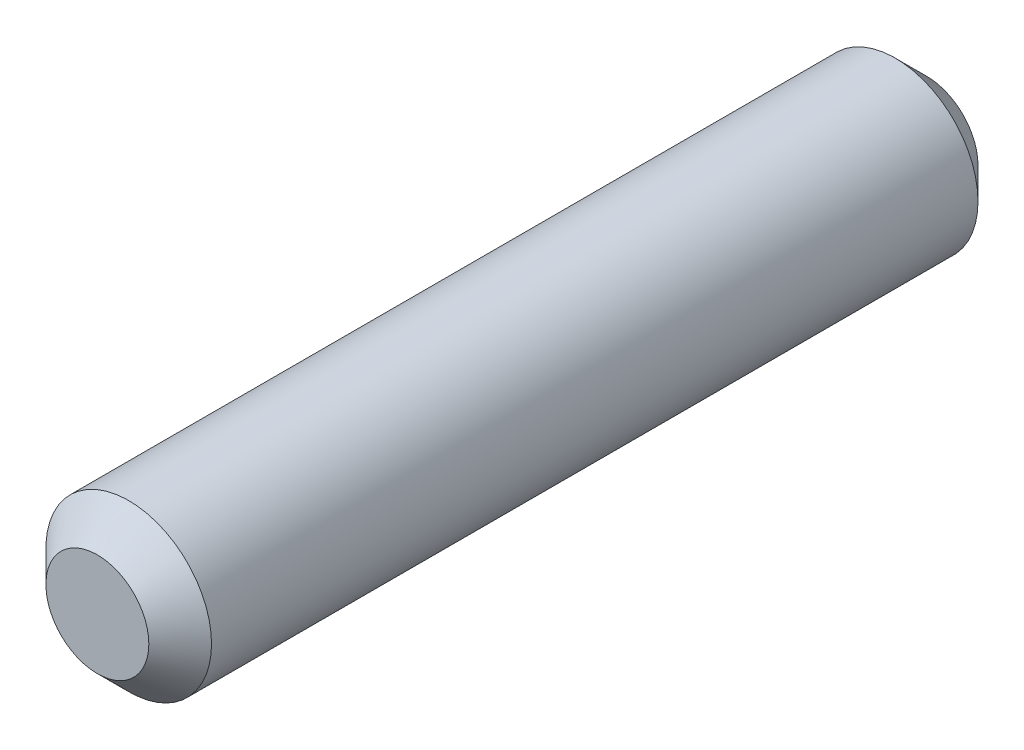
ISO-10303-21;
HEADER;
FILE_DESCRIPTION(('STEP AP214'),'2;1');
FILE_NAME('part.step','',(''),(''),'','','');
FILE_SCHEMA(('AUTOMOTIVE_DESIGN { 1 0 10303 214 1 1 1 1 }'));
ENDSEC;
DATA;
#1=APPLICATION_CONTEXT('core data for automotive mechanical design processes');
#2=APPLICATION_PROTOCOL_DEFINITION('international standard','automotive_design',2000,#1);
#3=PRODUCT_CONTEXT('',#1,'mechanical');
#4=PRODUCT('Part','Part','',(#3));
#5=PRODUCT_RELATED_PRODUCT_CATEGORY('part','',(#4));
#6=PRODUCT_DEFINITION_FORMATION('','',#4);
#7=PRODUCT_DEFINITION_CONTEXT('part definition',#1,'design');
#8=PRODUCT_DEFINITION('design','',#6,#7);
#9=PRODUCT_DEFINITION_SHAPE('','',#8);
#10=(LENGTH_UNIT() NAMED_UNIT(*) SI_UNIT(.MILLI.,.METRE.));
#11=(NAMED_UNIT(*) PLANE_ANGLE_UNIT() SI_UNIT($,.RADIAN.));
#12=(NAMED_UNIT(*) SI_UNIT($,.STERADIAN.) SOLID_ANGLE_UNIT());
#13=UNCERTAINTY_MEASURE_WITH_UNIT(LENGTH_MEASURE(1.E-05),#10,'distance_accuracy_value','');
#14=(GEOMETRIC_REPRESENTATION_CONTEXT(3) GLOBAL_UNCERTAINTY_ASSIGNED_CONTEXT((#13)) GLOBAL_UNIT_ASSIGNED_CONTEXT((#10,
#11,#12)) REPRESENTATION_CONTEXT('',''));
#15=CARTESIAN_POINT('',(0.,0.,0.));
#16=DIRECTION('',(0.,0.,1.));
#17=DIRECTION('',(1.,0.,0.));
#18=AXIS2_PLACEMENT_3D('',#15,#16,#17);
#19=CARTESIAN_POINT('',(0.,0.,7.935));
#20=DIRECTION('',(0.,0.,-1.));
#21=DIRECTION('',(-1.,0.,0.));
#22=AXIS2_PLACEMENT_3D('',#19,#20,#21);
#23=CYLINDRICAL_SURFACE('',#22,1.585);
#24=CARTESIAN_POINT('',(0.,0.,-7.335));
#25=DIRECTION('',(0.,0.,1.));
#26=DIRECTION('',(1.,0.,0.));
#27=AXIS2_PLACEMENT_3D('',#24,#25,#26);
#28=CIRCLE('',#27,1.585);
#29=CARTESIAN_POINT('',(1.585,0.,-7.335));
#30=VERTEX_POINT('',#29);
#31=EDGE_CURVE('E57',#30,#30,#28,.T.);
#32=ORIENTED_EDGE('',*,*,#31,.T.);
#33=EDGE_LOOP('',(#32));
#34=FACE_BOUND('',#33,.T.);
#35=CARTESIAN_POINT('',(0.,0.,7.335));
#36=DIRECTION('',(0.,0.,1.));
#37=DIRECTION('',(1.,0.,0.));
#38=AXIS2_PLACEMENT_3D('',#35,#36,#37);
#39=CIRCLE('',#38,1.585);
#40=CARTESIAN_POINT('',(1.585,0.,7.335));
#41=VERTEX_POINT('',#40);
#42=EDGE_CURVE('E62',#41,#41,#39,.F.);
#43=ORIENTED_EDGE('',*,*,#42,.T.);
#44=EDGE_LOOP('',(#43));
#45=FACE_BOUND('',#44,.T.);
#46=ADVANCED_FACE('F43',(#34,#45),#23,.T.);
#47=CARTESIAN_POINT('',(0.,0.,7.935));
#48=DIRECTION('',(0.,0.,1.));
#49=DIRECTION('',(1.,0.,0.));
#50=AXIS2_PLACEMENT_3D('',#47,#48,#49);
#51=PLANE('',#50);
#52=CARTESIAN_POINT('',(0.,0.,7.935));
#53=DIRECTION('',(0.,0.,1.));
#54=DIRECTION('',(1.,0.,0.));
#55=AXIS2_PLACEMENT_3D('',#52,#53,#54);
#56=CIRCLE('',#55,0.984999999999998);
#57=CARTESIAN_POINT('',(0.984999999999998,0.,7.935));
#58=VERTEX_POINT('',#57);
#59=EDGE_CURVE('E10',#58,#58,#56,.T.);
#60=ORIENTED_EDGE('',*,*,#59,.T.);
#61=EDGE_LOOP('',(#60));
#62=FACE_BOUND('',#61,.T.);
#63=ADVANCED_FACE('F79',(#62),#51,.T.);
#64=CARTESIAN_POINT('',(0.,0.,-7.935));
#65=DIRECTION('',(0.,0.,1.));
#66=DIRECTION('',(1.,0.,0.));
#67=AXIS2_PLACEMENT_3D('',#64,#65,#66);
#68=PLANE('',#67);
#69=CARTESIAN_POINT('',(0.,0.,-7.935));
#70=DIRECTION('',(0.,0.,1.));
#71=DIRECTION('',(1.,0.,0.));
#72=AXIS2_PLACEMENT_3D('',#69,#70,#71);
#73=CIRCLE('',#72,0.984999999999998);
#74=CARTESIAN_POINT('',(0.984999999999997,0.,-7.935));
#75=VERTEX_POINT('',#74);
#76=EDGE_CURVE('E52',#75,#75,#73,.F.);
#77=ORIENTED_EDGE('',*,*,#76,.T.);
#78=EDGE_LOOP('',(#77));
#79=FACE_BOUND('',#78,.T.);
#80=ADVANCED_FACE('F76',(#79),#68,.F.);
#81=CARTESIAN_POINT('',(0.,0.,-7.335));
#82=DIRECTION('',(0.,0.,1.));
#83=DIRECTION('',(1.,0.,0.));
#84=AXIS2_PLACEMENT_3D('',#81,#82,#83);
#85=CONICAL_SURFACE('',#84,1.585,0.785398163397449);
#86=CARTESIAN_POINT('',(0.984999999999997,0.,-7.935));
#87=CARTESIAN_POINT('',(0.991249999999997,0.,-7.92875));
#88=CARTESIAN_POINT('',(0.997499999999997,0.,-7.9225));
#89=CARTESIAN_POINT('',(1.01,0.,-7.91));
#90=CARTESIAN_POINT('',(1.01625,0.,-7.90375));
#91=CARTESIAN_POINT('',(1.02875,0.,-7.89125));
#92=CARTESIAN_POINT('',(1.035,0.,-7.885));
#93=CARTESIAN_POINT('',(1.0475,0.,-7.8725));
#94=CARTESIAN_POINT('',(1.05375,0.,-7.86625));
#95=CARTESIAN_POINT('',(1.06625,0.,-7.85375));
#96=CARTESIAN_POINT('',(1.0725,0.,-7.8475));
#97=CARTESIAN_POINT('',(1.085,0.,-7.835));
#98=CARTESIAN_POINT('',(1.09125,0.,-7.82875));
#99=CARTESIAN_POINT('',(1.10375,0.,-7.81625));
#100=CARTESIAN_POINT('',(1.11,0.,-7.81));
#101=CARTESIAN_POINT('',(1.1225,0.,-7.7975));
#102=CARTESIAN_POINT('',(1.12875,0.,-7.79125));
#103=CARTESIAN_POINT('',(1.14125,0.,-7.77875));
#104=CARTESIAN_POINT('',(1.1475,0.,-7.7725));
#105=CARTESIAN_POINT('',(1.16,0.,-7.76));
#106=CARTESIAN_POINT('',(1.16625,0.,-7.75375));
#107=CARTESIAN_POINT('',(1.17875,0.,-7.74125));
#108=CARTESIAN_POINT('',(1.185,0.,-7.735));
#109=CARTESIAN_POINT('',(1.1975,0.,-7.7225));
#110=CARTESIAN_POINT('',(1.20375,0.,-7.71625));
#111=CARTESIAN_POINT('',(1.21625,0.,-7.70375));
#112=CARTESIAN_POINT('',(1.2225,0.,-7.6975));
#113=CARTESIAN_POINT('',(1.235,0.,-7.685));
#114=CARTESIAN_POINT('',(1.24125,0.,-7.67875));
#115=CARTESIAN_POINT('',(1.25375,0.,-7.66625));
#116=CARTESIAN_POINT('',(1.26,0.,-7.66));
#117=CARTESIAN_POINT('',(1.2725,0.,-7.6475));
#118=CARTESIAN_POINT('',(1.27875,0.,-7.64125));
#119=CARTESIAN_POINT('',(1.29125,0.,-7.62875));
#120=CARTESIAN_POINT('',(1.2975,0.,-7.6225));
#121=CARTESIAN_POINT('',(1.31,0.,-7.61));
#122=CARTESIAN_POINT('',(1.31625,0.,-7.60375));
#123=CARTESIAN_POINT('',(1.32875,0.,-7.59125));
#124=CARTESIAN_POINT('',(1.335,0.,-7.585));
#125=CARTESIAN_POINT('',(1.3475,0.,-7.5725));
#126=CARTESIAN_POINT('',(1.35375,0.,-7.56625));
#127=CARTESIAN_POINT('',(1.36625,0.,-7.55375));
#128=CARTESIAN_POINT('',(1.3725,0.,-7.5475));
#129=CARTESIAN_POINT('',(1.385,0.,-7.535));
#130=CARTESIAN_POINT('',(1.39125,0.,-7.52875));
#131=CARTESIAN_POINT('',(1.40375,0.,-7.51625));
#132=CARTESIAN_POINT('',(1.41,0.,-7.51));
#133=CARTESIAN_POINT('',(1.4225,0.,-7.4975));
#134=CARTESIAN_POINT('',(1.42875,0.,-7.49125));
#135=CARTESIAN_POINT('',(1.44125,0.,-7.47875));
#136=CARTESIAN_POINT('',(1.4475,0.,-7.4725));
#137=CARTESIAN_POINT('',(1.46,0.,-7.46));
#138=CARTESIAN_POINT('',(1.46625,0.,-7.45375));
#139=CARTESIAN_POINT('',(1.47875,0.,-7.44125));
#140=CARTESIAN_POINT('',(1.485,0.,-7.435));
#141=CARTESIAN_POINT('',(1.4975,0.,-7.4225));
#142=CARTESIAN_POINT('',(1.50375,0.,-7.41625));
#143=CARTESIAN_POINT('',(1.51625,0.,-7.40375));
#144=CARTESIAN_POINT('',(1.5225,0.,-7.3975));
#145=CARTESIAN_POINT('',(1.535,0.,-7.385));
#146=CARTESIAN_POINT('',(1.54125,0.,-7.37875));
#147=CARTESIAN_POINT('',(1.55375,0.,-7.36625));
#148=CARTESIAN_POINT('',(1.56,0.,-7.36));
#149=CARTESIAN_POINT('',(1.5725,0.,-7.3475));
#150=CARTESIAN_POINT('',(1.57875,0.,-7.34125));
#151=CARTESIAN_POINT('',(1.585,0.,-7.335));
#152=B_SPLINE_CURVE_WITH_KNOTS('',3,(#86,#87,#88,#89,#90,#91,#92,#93,#94,#95,#96,#97,#98,#99,
#100,#101,#102,#103,#104,#105,#106,#107,#108,#109,#110,#111,#112,#113,#114,#115,#116,#117,#118,
#119,#120,#121,#122,#123,#124,#125,#126,#127,#128,#129,#130,#131,#132,#133,#134,#135,#136,#137,
#138,#139,#140,#141,#142,#143,#144,#145,#146,#147,#148,#149,#150,#151),.UNSPECIFIED.,.F.,.F.,(4,
2,2,2,2,2,2,2,2,2,2,2,2,2,2,2,2,2,2,2,2,2,2,2,2,2,2,2,2,2,2,2,4),(0.,0.0265165042944954,
0.0530330085889906,0.0795495128834861,0.106066017177981,0.132582521472478,0.159099025766973,
0.185615530061469,0.212132034355965,0.23864853865046,0.265165042944956,0.291681547239451,
0.318198051533947,0.344714555828443,0.371231060122938,0.397747564417434,0.424264068711929,
0.450780573006425,0.477297077300921,0.503813581595417,0.530330085889912,0.556846590184408,
0.583363094478903,0.609879598773399,0.636396103067895,0.66291260736239,0.689429111656886,
0.715945615951381,0.742462120245877,0.768978624540373,0.795495128834869,0.822011633129364,
0.84852813742386),.UNSPECIFIED.);
#153=EDGE_CURVE('BSEAM72',#75,#30,#152,.T.);
#154=ORIENTED_EDGE('',*,*,#76,.F.);
#155=ORIENTED_EDGE('',*,*,#31,.F.);
#156=ORIENTED_EDGE('',*,*,#153,.T.);
#157=ORIENTED_EDGE('',*,*,#153,.F.);
#158=EDGE_LOOP('',(#154,#156,#155,#157));
#159=FACE_BOUND('',#158,.T.);
#160=ADVANCED_FACE('F72',(#159),#85,.T.);
#161=CARTESIAN_POINT('',(0.,0.,7.935));
#162=DIRECTION('',(0.,0.,-1.));
#163=DIRECTION('',(-1.,0.,0.));
#164=AXIS2_PLACEMENT_3D('',#161,#162,#163);
#165=CONICAL_SURFACE('',#164,0.984999999999998,0.785398163397448);
#166=ORIENTED_EDGE('',*,*,#42,.F.);
#167=EDGE_LOOP('',(#166));
#168=FACE_BOUND('',#167,.T.);
#169=ORIENTED_EDGE('',*,*,#59,.F.);
#170=EDGE_LOOP('',(#169));
#171=FACE_BOUND('',#170,.T.);
#172=ADVANCED_FACE('F46',(#168,#171),#165,.T.);
#173=CLOSED_SHELL('',(#46,#63,#80,#160,#172));
#174=MANIFOLD_SOLID_BREP('B2',#173);
#175=ADVANCED_BREP_SHAPE_REPRESENTATION('',(#18,#174),#14);
#176=SHAPE_DEFINITION_REPRESENTATION(#9,#175);
ENDSEC;
END-ISO-10303-21;
